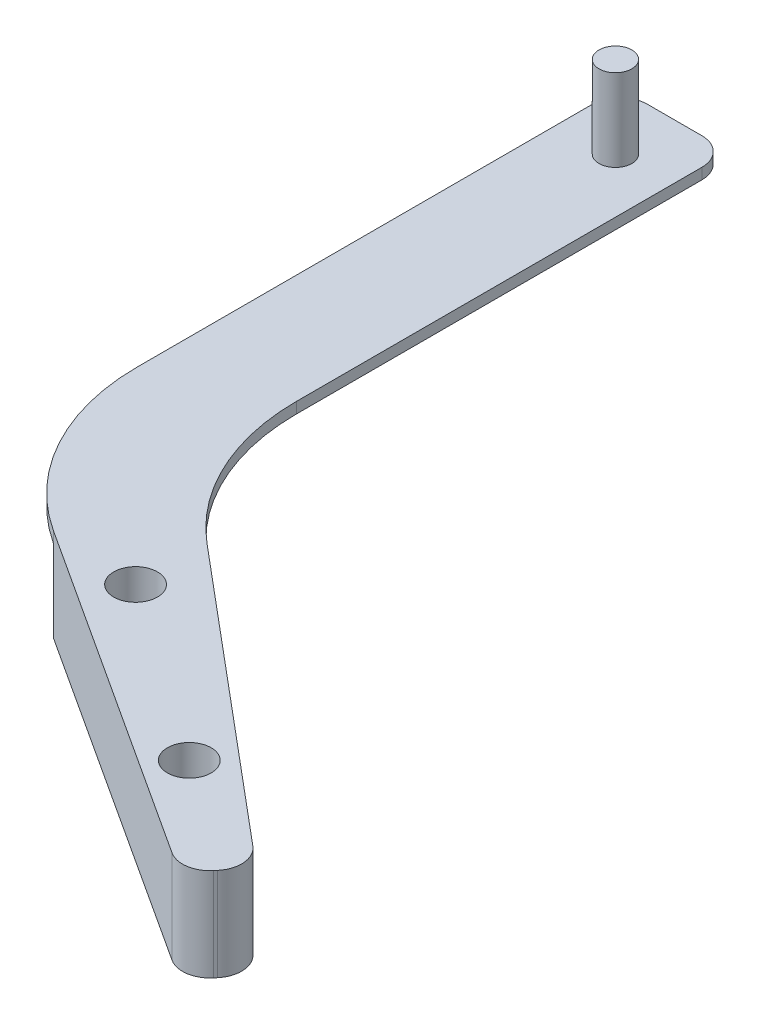
ISO-10303-21;
HEADER;
FILE_DESCRIPTION(('STEP AP214'),'2;1');
FILE_NAME('part.step','',(''),(''),'','','');
FILE_SCHEMA(('AUTOMOTIVE_DESIGN { 1 0 10303 214 1 1 1 1 }'));
ENDSEC;
DATA;
#1=APPLICATION_CONTEXT('core data for automotive mechanical design processes');
#2=APPLICATION_PROTOCOL_DEFINITION('international standard','automotive_design',2000,#1);
#3=PRODUCT_CONTEXT('',#1,'mechanical');
#4=PRODUCT('Part','Part','',(#3));
#5=PRODUCT_RELATED_PRODUCT_CATEGORY('part','',(#4));
#6=PRODUCT_DEFINITION_FORMATION('','',#4);
#7=PRODUCT_DEFINITION_CONTEXT('part definition',#1,'design');
#8=PRODUCT_DEFINITION('design','',#6,#7);
#9=PRODUCT_DEFINITION_SHAPE('','',#8);
#10=(LENGTH_UNIT() NAMED_UNIT(*) SI_UNIT(.MILLI.,.METRE.));
#11=(NAMED_UNIT(*) PLANE_ANGLE_UNIT() SI_UNIT($,.RADIAN.));
#12=(NAMED_UNIT(*) SI_UNIT($,.STERADIAN.) SOLID_ANGLE_UNIT());
#13=UNCERTAINTY_MEASURE_WITH_UNIT(LENGTH_MEASURE(1.E-05),#10,'distance_accuracy_value','');
#14=(GEOMETRIC_REPRESENTATION_CONTEXT(3) GLOBAL_UNCERTAINTY_ASSIGNED_CONTEXT((#13)) GLOBAL_UNIT_ASSIGNED_CONTEXT((#10,
#11,#12)) REPRESENTATION_CONTEXT('',''));
#15=CARTESIAN_POINT('',(0.,0.,0.));
#16=DIRECTION('',(0.,0.,1.));
#17=DIRECTION('',(1.,0.,0.));
#18=AXIS2_PLACEMENT_3D('',#15,#16,#17);
#19=CARTESIAN_POINT('',(73.8670567945439,-2.,66.6448966940016));
#20=DIRECTION('',(0.766044443118979,0.,0.642787609686538));
#21=DIRECTION('',(0.642787609686538,0.,-0.766044443118979));
#22=AXIS2_PLACEMENT_3D('',#19,#20,#21);
#23=PLANE('',#22);
#24=DIRECTION('',(0.642787609686538,0.,-0.766044443118979));
#25=VECTOR('',#24,1.);
#26=CARTESIAN_POINT('',(73.8670567945439,0.,66.6448966940016));
#27=LINE('',#26,#25);
#28=CARTESIAN_POINT('',(76.7105089847099,0.,63.2562023310013));
#29=VERTEX_POINT('',#28);
#30=CARTESIAN_POINT('',(77.0809948429766,0.,62.8146744784067));
#31=VERTEX_POINT('',#30);
#32=EDGE_CURVE('E197',#29,#31,#27,.T.);
#33=ORIENTED_EDGE('',*,*,#32,.F.);
#34=DIRECTION('',(0.,1.,0.));
#35=VECTOR('',#34,1.);
#36=CARTESIAN_POINT('',(76.7105089847099,-2.,63.2562023310013));
#37=LINE('',#36,#35);
#38=CARTESIAN_POINT('',(76.7105089847099,-17.,63.2562023310013));
#39=VERTEX_POINT('',#38);
#40=EDGE_CURVE('E282',#29,#39,#37,.F.);
#41=ORIENTED_EDGE('',*,*,#40,.T.);
#42=DIRECTION('',(-0.642787609686538,0.,0.766044443118979));
#43=VECTOR('',#42,1.);
#44=CARTESIAN_POINT('',(73.8670567945439,-17.,66.6448966940016));
#45=LINE('',#44,#43);
#46=CARTESIAN_POINT('',(77.0809948429766,-17.,62.8146744784067));
#47=VERTEX_POINT('',#46);
#48=EDGE_CURVE('E166',#47,#39,#45,.T.);
#49=ORIENTED_EDGE('',*,*,#48,.F.);
#50=DIRECTION('',(0.,1.,0.));
#51=VECTOR('',#50,1.);
#52=CARTESIAN_POINT('',(77.0809948429766,-2.,62.8146744784067));
#53=LINE('',#52,#51);
#54=EDGE_CURVE('E278',#47,#31,#53,.T.);
#55=ORIENTED_EDGE('',*,*,#54,.T.);
#56=EDGE_LOOP('',(#33,#41,#49,#55));
#57=FACE_BOUND('',#56,.T.);
#58=ADVANCED_FACE('F54',(#57),#23,.T.);
#59=CARTESIAN_POINT('',(8.21443859940037,-2.,24.0095879247784));
#60=DIRECTION('',(-0.544639035015027,0.,0.838670567945424));
#61=DIRECTION('',(0.838670567945424,0.,0.544639035015027));
#62=AXIS2_PLACEMENT_3D('',#59,#60,#61);
#63=PLANE('',#62);
#64=DIRECTION('',(-0.838670567945424,0.,-0.544639035015027));
#65=VECTOR('',#64,1.);
#66=CARTESIAN_POINT('',(8.21443859940037,-17.,24.0095879247784));
#67=LINE('',#66,#65);
#68=CARTESIAN_POINT('',(70.1570915940399,-17.,64.2356171222957));
#69=VERTEX_POINT('',#68);
#70=CARTESIAN_POINT('',(8.21443859940037,-17.,24.0095879247784));
#71=VERTEX_POINT('',#70);
#72=EDGE_CURVE('E174',#69,#71,#67,.T.);
#73=ORIENTED_EDGE('',*,*,#72,.F.);
#74=DIRECTION('',(0.,1.,0.));
#75=VECTOR('',#74,1.);
#76=CARTESIAN_POINT('',(70.1570915940399,-2.,64.2356171222957));
#77=LINE('',#76,#75);
#78=CARTESIAN_POINT('',(70.1570915940399,0.,64.2356171222957));
#79=VERTEX_POINT('',#78);
#80=EDGE_CURVE('E262',#69,#79,#77,.T.);
#81=ORIENTED_EDGE('',*,*,#80,.T.);
#82=DIRECTION('',(0.838670567945424,0.,0.544639035015027));
#83=VECTOR('',#82,1.);
#84=CARTESIAN_POINT('',(8.21443859940037,0.,24.0095879247784));
#85=LINE('',#84,#83);
#86=CARTESIAN_POINT('',(8.21443859940037,0.,24.0095879247784));
#87=VERTEX_POINT('',#86);
#88=EDGE_CURVE('E203',#87,#79,#85,.T.);
#89=ORIENTED_EDGE('',*,*,#88,.F.);
#90=DIRECTION('',(0.,1.,0.));
#91=VECTOR('',#90,1.);
#92=CARTESIAN_POINT('',(8.21443859940037,-2.,24.0095879247784));
#93=LINE('',#92,#91);
#94=CARTESIAN_POINT('',(8.21443859940037,-2.,24.0095879247784));
#95=VERTEX_POINT('',#94);
#96=EDGE_CURVE('E246',#95,#87,#93,.T.);
#97=ORIENTED_EDGE('',*,*,#96,.F.);
#98=DIRECTION('',(0.,1.,0.));
#99=VECTOR('',#98,1.);
#100=CARTESIAN_POINT('',(8.21443859940037,-17.,24.0095879247784));
#101=LINE('',#100,#99);
#102=EDGE_CURVE('E184',#71,#95,#101,.T.);
#103=ORIENTED_EDGE('',*,*,#102,.F.);
#104=EDGE_LOOP('',(#73,#81,#89,#97,#103));
#105=FACE_BOUND('',#104,.T.);
#106=ADVANCED_FACE('F324',(#105),#63,.T.);
#107=CARTESIAN_POINT('',(30.0000000000011,-2.,-9.53723479304036));
#108=DIRECTION('',(0.,1.,0.));
#109=DIRECTION('',(0.,0.,1.));
#110=AXIS2_PLACEMENT_3D('',#107,#108,#109);
#111=CYLINDRICAL_SURFACE('',#110,40.0000000000005);
#112=CARTESIAN_POINT('',(30.0000000000011,0.,-9.53723479304036));
#113=DIRECTION('',(0.,1.,0.));
#114=DIRECTION('',(0.,0.,-1.));
#115=AXIS2_PLACEMENT_3D('',#112,#113,#114);
#116=CIRCLE('',#115,40.0000000000005);
#117=CARTESIAN_POINT('',(-9.99999999999939,0.,-9.53723479303865));
#118=VERTEX_POINT('',#117);
#119=EDGE_CURVE('E239',#118,#87,#116,.T.);
#120=ORIENTED_EDGE('',*,*,#119,.F.);
#121=DIRECTION('',(0.,1.,0.));
#122=VECTOR('',#121,1.);
#123=CARTESIAN_POINT('',(-9.99999999999939,-2.,-9.53723479303865));
#124=LINE('',#123,#122);
#125=CARTESIAN_POINT('',(-9.99999999999939,-2.,-9.53723479303865));
#126=VERTEX_POINT('',#125);
#127=EDGE_CURVE('E250',#126,#118,#124,.T.);
#128=ORIENTED_EDGE('',*,*,#127,.F.);
#129=CARTESIAN_POINT('',(30.0000000000011,-2.,-9.53723479304036));
#130=DIRECTION('',(0.,1.,0.));
#131=DIRECTION('',(0.,0.,-1.));
#132=AXIS2_PLACEMENT_3D('',#129,#130,#131);
#133=CIRCLE('',#132,40.0000000000005);
#134=EDGE_CURVE('E213',#126,#95,#133,.T.);
#135=ORIENTED_EDGE('',*,*,#134,.T.);
#136=ORIENTED_EDGE('',*,*,#96,.T.);
#137=EDGE_LOOP('',(#120,#128,#135,#136));
#138=FACE_BOUND('',#137,.T.);
#139=ADVANCED_FACE('F320',(#138),#111,.T.);
#140=CARTESIAN_POINT('',(-9.99999999999864,-2.,-97.8190068075028));
#141=DIRECTION('',(-1.,0.,0.));
#142=DIRECTION('',(0.,0.,1.));
#143=AXIS2_PLACEMENT_3D('',#140,#141,#142);
#144=PLANE('',#143);
#145=DIRECTION('',(0.,0.,1.));
#146=VECTOR('',#145,1.);
#147=CARTESIAN_POINT('',(-9.99999999999864,0.,-97.8190068075028));
#148=LINE('',#147,#146);
#149=CARTESIAN_POINT('',(-9.99999999999864,0.,-92.8190068075028));
#150=VERTEX_POINT('',#149);
#151=EDGE_CURVE('E236',#150,#118,#148,.T.);
#152=ORIENTED_EDGE('',*,*,#151,.F.);
#153=DIRECTION('',(0.,1.,0.));
#154=VECTOR('',#153,1.);
#155=CARTESIAN_POINT('',(-9.99999999999864,-2.,-92.8190068075028));
#156=LINE('',#155,#154);
#157=CARTESIAN_POINT('',(-9.99999999999864,-2.,-92.8190068075028));
#158=VERTEX_POINT('',#157);
#159=EDGE_CURVE('E78',#150,#158,#156,.F.);
#160=ORIENTED_EDGE('',*,*,#159,.T.);
#161=DIRECTION('',(0.,0.,1.));
#162=VECTOR('',#161,1.);
#163=CARTESIAN_POINT('',(-9.99999999999864,-2.,-97.8190068075028));
#164=LINE('',#163,#162);
#165=EDGE_CURVE('E210',#158,#126,#164,.T.);
#166=ORIENTED_EDGE('',*,*,#165,.T.);
#167=ORIENTED_EDGE('',*,*,#127,.T.);
#168=EDGE_LOOP('',(#152,#160,#166,#167));
#169=FACE_BOUND('',#168,.T.);
#170=ADVANCED_FACE('F316',(#169),#144,.T.);
#171=CARTESIAN_POINT('',(10.0000000000014,-2.,-97.8190068075028));
#172=DIRECTION('',(0.,0.,-1.));
#173=DIRECTION('',(-1.,0.,0.));
#174=AXIS2_PLACEMENT_3D('',#171,#172,#173);
#175=PLANE('',#174);
#176=DIRECTION('',(-1.,0.,0.));
#177=VECTOR('',#176,1.);
#178=CARTESIAN_POINT('',(10.0000000000014,-2.,-97.8190068075028));
#179=LINE('',#178,#177);
#180=CARTESIAN_POINT('',(5.00000000000136,-2.,-97.8190068075028));
#181=VERTEX_POINT('',#180);
#182=CARTESIAN_POINT('',(-4.99999999999864,-2.,-97.8190068075028));
#183=VERTEX_POINT('',#182);
#184=EDGE_CURVE('E206',#181,#183,#179,.T.);
#185=ORIENTED_EDGE('',*,*,#184,.T.);
#186=DIRECTION('',(0.,1.,0.));
#187=VECTOR('',#186,1.);
#188=CARTESIAN_POINT('',(-4.99999999999864,-2.,-97.8190068075028));
#189=LINE('',#188,#187);
#190=CARTESIAN_POINT('',(-4.99999999999864,0.,-97.8190068075028));
#191=VERTEX_POINT('',#190);
#192=EDGE_CURVE('E296',#183,#191,#189,.T.);
#193=ORIENTED_EDGE('',*,*,#192,.T.);
#194=DIRECTION('',(-1.,0.,0.));
#195=VECTOR('',#194,1.);
#196=CARTESIAN_POINT('',(10.0000000000014,0.,-97.8190068075028));
#197=LINE('',#196,#195);
#198=CARTESIAN_POINT('',(5.00000000000136,0.,-97.8190068075028));
#199=VERTEX_POINT('',#198);
#200=EDGE_CURVE('E232',#199,#191,#197,.T.);
#201=ORIENTED_EDGE('',*,*,#200,.F.);
#202=DIRECTION('',(0.,1.,0.));
#203=VECTOR('',#202,1.);
#204=CARTESIAN_POINT('',(5.00000000000136,-2.,-97.8190068075028));
#205=LINE('',#204,#203);
#206=EDGE_CURVE('E293',#199,#181,#205,.F.);
#207=ORIENTED_EDGE('',*,*,#206,.T.);
#208=EDGE_LOOP('',(#185,#193,#201,#207));
#209=FACE_BOUND('',#208,.T.);
#210=ADVANCED_FACE('F310',(#209),#175,.T.);
#211=CARTESIAN_POINT('',(10.0000000000014,-2.,-18.6523063262));
#212=DIRECTION('',(1.,0.,0.));
#213=DIRECTION('',(0.,0.,-1.));
#214=AXIS2_PLACEMENT_3D('',#211,#212,#213);
#215=PLANE('',#214);
#216=DIRECTION('',(0.,0.,-1.));
#217=VECTOR('',#216,1.);
#218=CARTESIAN_POINT('',(10.0000000000014,-2.,-18.6523063262));
#219=LINE('',#218,#217);
#220=CARTESIAN_POINT('',(10.0000000000014,-2.,-18.6523063262));
#221=VERTEX_POINT('',#220);
#222=CARTESIAN_POINT('',(10.0000000000014,-2.,-92.8190068075028));
#223=VERTEX_POINT('',#222);
#224=EDGE_CURVE('E202',#221,#223,#219,.T.);
#225=ORIENTED_EDGE('',*,*,#224,.T.);
#226=DIRECTION('',(0.,1.,0.));
#227=VECTOR('',#226,1.);
#228=CARTESIAN_POINT('',(10.0000000000014,-2.,-92.8190068075028));
#229=LINE('',#228,#227);
#230=CARTESIAN_POINT('',(10.0000000000014,0.,-92.8190068075028));
#231=VERTEX_POINT('',#230);
#232=EDGE_CURVE('E13',#223,#231,#229,.T.);
#233=ORIENTED_EDGE('',*,*,#232,.T.);
#234=DIRECTION('',(0.,0.,-1.));
#235=VECTOR('',#234,1.);
#236=CARTESIAN_POINT('',(10.0000000000014,0.,-18.6523063262));
#237=LINE('',#236,#235);
#238=CARTESIAN_POINT('',(10.0000000000014,0.,-18.6523063262));
#239=VERTEX_POINT('',#238);
#240=EDGE_CURVE('E228',#239,#231,#237,.T.);
#241=ORIENTED_EDGE('',*,*,#240,.F.);
#242=DIRECTION('',(0.,1.,0.));
#243=VECTOR('',#242,1.);
#244=CARTESIAN_POINT('',(10.0000000000014,-2.,-18.6523063262));
#245=LINE('',#244,#243);
#246=EDGE_CURVE('E254',#221,#239,#245,.T.);
#247=ORIENTED_EDGE('',*,*,#246,.F.);
#248=EDGE_LOOP('',(#225,#233,#241,#247));
#249=FACE_BOUND('',#248,.T.);
#250=ADVANCED_FACE('F342',(#249),#215,.T.);
#251=CARTESIAN_POINT('',(50.,-2.,-18.6523063262));
#252=DIRECTION('',(0.,1.,0.));
#253=DIRECTION('',(0.,0.,1.));
#254=AXIS2_PLACEMENT_3D('',#251,#252,#253);
#255=CYLINDRICAL_SURFACE('',#254,39.9999999999989);
#256=CARTESIAN_POINT('',(50.,0.,-18.6523063262));
#257=DIRECTION('',(0.,-1.,0.));
#258=DIRECTION('',(0.,0.,-1.));
#259=AXIS2_PLACEMENT_3D('',#256,#257,#258);
#260=CIRCLE('',#259,39.9999999999989);
#261=CARTESIAN_POINT('',(24.28849561254,0.,11.989471398559));
#262=VERTEX_POINT('',#261);
#263=EDGE_CURVE('E224',#262,#239,#260,.T.);
#264=ORIENTED_EDGE('',*,*,#263,.F.);
#265=DIRECTION('',(0.,1.,0.));
#266=VECTOR('',#265,1.);
#267=CARTESIAN_POINT('',(24.28849561254,-2.,11.989471398559));
#268=LINE('',#267,#266);
#269=CARTESIAN_POINT('',(24.28849561254,-2.,11.989471398559));
#270=VERTEX_POINT('',#269);
#271=EDGE_CURVE('E217',#270,#262,#268,.T.);
#272=ORIENTED_EDGE('',*,*,#271,.F.);
#273=CARTESIAN_POINT('',(50.,-2.,-18.6523063262));
#274=DIRECTION('',(0.,-1.,0.));
#275=DIRECTION('',(0.,0.,-1.));
#276=AXIS2_PLACEMENT_3D('',#273,#274,#275);
#277=CIRCLE('',#276,39.9999999999989);
#278=EDGE_CURVE('E198',#270,#221,#277,.T.);
#279=ORIENTED_EDGE('',*,*,#278,.T.);
#280=ORIENTED_EDGE('',*,*,#246,.T.);
#281=EDGE_LOOP('',(#264,#272,#279,#280));
#282=FACE_BOUND('',#281,.T.);
#283=ADVANCED_FACE('F339',(#282),#255,.F.);
#284=CARTESIAN_POINT('',(80.2949328914093,-2.,58.9844522628118));
#285=DIRECTION('',(0.642787609686538,0.,-0.76604444311898));
#286=DIRECTION('',(-0.76604444311898,0.,-0.642787609686538));
#287=AXIS2_PLACEMENT_3D('',#284,#285,#286);
#288=PLANE('',#287);
#289=DIRECTION('',(-0.766044443118979,0.,-0.642787609686537));
#290=VECTOR('',#289,1.);
#291=CARTESIAN_POINT('',(80.2949328914093,0.,58.9844522628118));
#292=LINE('',#291,#290);
#293=CARTESIAN_POINT('',(76.4647106758144,0.,55.7705142143791));
#294=VERTEX_POINT('',#293);
#295=EDGE_CURVE('E221',#294,#262,#292,.T.);
#296=ORIENTED_EDGE('',*,*,#295,.F.);
#297=DIRECTION('',(0.,1.,0.));
#298=VECTOR('',#297,1.);
#299=CARTESIAN_POINT('',(76.4647106758144,-2.,55.7705142143791));
#300=LINE('',#299,#298);
#301=CARTESIAN_POINT('',(76.4647106758144,-17.,55.7705142143791));
#302=VERTEX_POINT('',#301);
#303=EDGE_CURVE('E162',#294,#302,#300,.F.);
#304=ORIENTED_EDGE('',*,*,#303,.T.);
#305=DIRECTION('',(0.766044443118977,0.,0.64278760968654));
#306=VECTOR('',#305,1.);
#307=CARTESIAN_POINT('',(80.2949328914093,-17.,58.9844522628118));
#308=LINE('',#307,#306);
#309=CARTESIAN_POINT('',(24.28849561254,-17.,11.989471398559));
#310=VERTEX_POINT('',#309);
#311=EDGE_CURVE('E153',#310,#302,#308,.T.);
#312=ORIENTED_EDGE('',*,*,#311,.F.);
#313=DIRECTION('',(0.,1.,0.));
#314=VECTOR('',#313,1.);
#315=CARTESIAN_POINT('',(24.28849561254,-17.,11.989471398559));
#316=LINE('',#315,#314);
#317=EDGE_CURVE('E159',#310,#270,#316,.T.);
#318=ORIENTED_EDGE('',*,*,#317,.T.);
#319=ORIENTED_EDGE('',*,*,#271,.T.);
#320=EDGE_LOOP('',(#296,#304,#312,#318,#319));
#321=FACE_BOUND('',#320,.T.);
#322=ADVANCED_FACE('F156',(#321),#288,.T.);
#323=CARTESIAN_POINT('',(50.,-2.,-18.6523063262));
#324=DIRECTION('',(0.,-1.,0.));
#325=DIRECTION('',(0.,0.,-1.));
#326=AXIS2_PLACEMENT_3D('',#323,#324,#325);
#327=PLANE('',#326);
#328=ORIENTED_EDGE('',*,*,#165,.F.);
#329=CARTESIAN_POINT('',(-4.99999999999864,-2.,-92.8190068075028));
#330=DIRECTION('',(0.,-1.,0.));
#331=DIRECTION('',(0.,0.,-1.));
#332=AXIS2_PLACEMENT_3D('',#329,#330,#331);
#333=CIRCLE('',#332,5.);
#334=EDGE_CURVE('E63',#158,#183,#333,.T.);
#335=ORIENTED_EDGE('',*,*,#334,.T.);
#336=ORIENTED_EDGE('',*,*,#184,.F.);
#337=CARTESIAN_POINT('',(5.00000000000136,-2.,-92.8190068075028));
#338=DIRECTION('',(0.,-1.,0.));
#339=DIRECTION('',(0.,0.,-1.));
#340=AXIS2_PLACEMENT_3D('',#337,#338,#339);
#341=CIRCLE('',#340,5.);
#342=EDGE_CURVE('E70',#181,#223,#341,.T.);
#343=ORIENTED_EDGE('',*,*,#342,.T.);
#344=ORIENTED_EDGE('',*,*,#224,.F.);
#345=ORIENTED_EDGE('',*,*,#278,.F.);
#346=DIRECTION('',(0.800846410293443,0.,-0.598869791457297));
#347=VECTOR('',#346,1.);
#348=CARTESIAN_POINT('',(24.28849561254,-2.,11.989471398559));
#349=LINE('',#348,#347);
#350=EDGE_CURVE('E179',#95,#270,#349,.T.);
#351=ORIENTED_EDGE('',*,*,#350,.F.);
#352=ORIENTED_EDGE('',*,*,#134,.F.);
#353=EDGE_LOOP('',(#328,#335,#336,#343,#344,#345,#351,#352));
#354=FACE_BOUND('',#353,.T.);
#355=ADVANCED_FACE('F305',(#354),#327,.T.);
#356=CARTESIAN_POINT('',(50.,0.,-18.6523063262));
#357=DIRECTION('',(0.,-1.,0.));
#358=DIRECTION('',(0.,0.,-1.));
#359=AXIS2_PLACEMENT_3D('',#356,#357,#358);
#360=PLANE('',#359);
#361=CARTESIAN_POINT('',(1.36349265211777E-12,0.,-87.));
#362=DIRECTION('',(0.,-1.,0.));
#363=DIRECTION('',(0.,0.,-1.));
#364=AXIS2_PLACEMENT_3D('',#361,#362,#363);
#365=CIRCLE('',#364,3.);
#366=CARTESIAN_POINT('',(1.36349265211777E-12,0.,-90.));
#367=VERTEX_POINT('',#366);
#368=EDGE_CURVE('E249',#367,#367,#365,.F.);
#369=ORIENTED_EDGE('',*,*,#368,.F.);
#370=EDGE_LOOP('',(#369));
#371=FACE_BOUND('',#370,.T.);
#372=CARTESIAN_POINT('',(24.2884956125399,0.,25.043544291882));
#373=DIRECTION('',(0.,1.,0.));
#374=DIRECTION('',(0.,0.,1.));
#375=AXIS2_PLACEMENT_3D('',#372,#373,#374);
#376=CIRCLE('',#375,4.);
#377=CARTESIAN_POINT('',(24.2884956125399,0.,29.043544291882));
#378=VERTEX_POINT('',#377);
#379=EDGE_CURVE('E183',#378,#378,#376,.T.);
#380=ORIENTED_EDGE('',*,*,#379,.F.);
#381=EDGE_LOOP('',(#380));
#382=FACE_BOUND('',#381,.T.);
#383=CARTESIAN_POINT('',(57.0545773840996,0.,47.9866017459238));
#384=DIRECTION('',(0.,1.,0.));
#385=DIRECTION('',(0.,0.,1.));
#386=AXIS2_PLACEMENT_3D('',#383,#384,#385);
#387=CIRCLE('',#386,4.00000000000001);
#388=CARTESIAN_POINT('',(57.0545773840996,0.,51.9866017459238));
#389=VERTEX_POINT('',#388);
#390=EDGE_CURVE('E189',#389,#389,#387,.T.);
#391=ORIENTED_EDGE('',*,*,#390,.F.);
#392=EDGE_LOOP('',(#391));
#393=FACE_BOUND('',#392,.T.);
#394=ORIENTED_EDGE('',*,*,#88,.T.);
#395=CARTESIAN_POINT('',(72.880286769115,0.,60.0422642825686));
#396=DIRECTION('',(0.,-1.,0.));
#397=DIRECTION('',(0.,0.,-1.));
#398=AXIS2_PLACEMENT_3D('',#395,#396,#397);
#399=CIRCLE('',#398,5.);
#400=EDGE_CURVE('E275',#79,#29,#399,.F.);
#401=ORIENTED_EDGE('',*,*,#400,.T.);
#402=ORIENTED_EDGE('',*,*,#32,.T.);
#403=CARTESIAN_POINT('',(73.2507726273817,0.,59.600736429974));
#404=DIRECTION('',(0.,-1.,0.));
#405=DIRECTION('',(0.,0.,-1.));
#406=AXIS2_PLACEMENT_3D('',#403,#404,#405);
#407=CIRCLE('',#406,5.);
#408=EDGE_CURVE('E272',#31,#294,#407,.F.);
#409=ORIENTED_EDGE('',*,*,#408,.T.);
#410=ORIENTED_EDGE('',*,*,#295,.T.);
#411=ORIENTED_EDGE('',*,*,#263,.T.);
#412=ORIENTED_EDGE('',*,*,#240,.T.);
#413=CARTESIAN_POINT('',(5.00000000000136,0.,-92.8190068075028));
#414=DIRECTION('',(0.,-1.,0.));
#415=DIRECTION('',(0.,0.,-1.));
#416=AXIS2_PLACEMENT_3D('',#413,#414,#415);
#417=CIRCLE('',#416,5.);
#418=EDGE_CURVE('E266',#231,#199,#417,.F.);
#419=ORIENTED_EDGE('',*,*,#418,.T.);
#420=ORIENTED_EDGE('',*,*,#200,.T.);
#421=CARTESIAN_POINT('',(-4.99999999999864,0.,-92.8190068075028));
#422=DIRECTION('',(0.,-1.,0.));
#423=DIRECTION('',(0.,0.,-1.));
#424=AXIS2_PLACEMENT_3D('',#421,#422,#423);
#425=CIRCLE('',#424,5.);
#426=EDGE_CURVE('E269',#191,#150,#425,.F.);
#427=ORIENTED_EDGE('',*,*,#426,.T.);
#428=ORIENTED_EDGE('',*,*,#151,.T.);
#429=ORIENTED_EDGE('',*,*,#119,.T.);
#430=EDGE_LOOP('',(#394,#401,#402,#409,#410,#411,#412,#419,#420,#427,#428,#429));
#431=FACE_BOUND('',#430,.T.);
#432=ADVANCED_FACE('F315',(#371,#382,#393,#431),#360,.F.);
#433=CARTESIAN_POINT('',(57.0545773840996,-2.,47.9866017459238));
#434=DIRECTION('',(0.,1.,0.));
#435=DIRECTION('',(0.,0.,1.));
#436=AXIS2_PLACEMENT_3D('',#433,#434,#435);
#437=CYLINDRICAL_SURFACE('',#436,4.00000000000001);
#438=ORIENTED_EDGE('',*,*,#390,.T.);
#439=EDGE_LOOP('',(#438));
#440=FACE_BOUND('',#439,.T.);
#441=CARTESIAN_POINT('',(57.0545773840996,-17.,47.9866017459238));
#442=DIRECTION('',(0.,-1.,0.));
#443=DIRECTION('',(0.,0.,-1.));
#444=AXIS2_PLACEMENT_3D('',#441,#442,#443);
#445=CIRCLE('',#444,4.00000000000001);
#446=CARTESIAN_POINT('',(57.0545773840996,-17.,43.9866017459238));
#447=VERTEX_POINT('',#446);
#448=EDGE_CURVE('E560',#447,#447,#445,.T.);
#449=ORIENTED_EDGE('',*,*,#448,.T.);
#450=EDGE_LOOP('',(#449));
#451=FACE_BOUND('',#450,.T.);
#452=ADVANCED_FACE('F425',(#440,#451),#437,.F.);
#453=CARTESIAN_POINT('',(24.2884956125399,-2.,25.043544291882));
#454=DIRECTION('',(0.,1.,0.));
#455=DIRECTION('',(0.,0.,1.));
#456=AXIS2_PLACEMENT_3D('',#453,#454,#455);
#457=CYLINDRICAL_SURFACE('',#456,4.);
#458=ORIENTED_EDGE('',*,*,#379,.T.);
#459=EDGE_LOOP('',(#458));
#460=FACE_BOUND('',#459,.T.);
#461=CARTESIAN_POINT('',(24.2884956125399,-17.,25.043544291882));
#462=DIRECTION('',(0.,-1.,0.));
#463=DIRECTION('',(0.,0.,-1.));
#464=AXIS2_PLACEMENT_3D('',#461,#462,#463);
#465=CIRCLE('',#464,4.);
#466=CARTESIAN_POINT('',(24.2884956125399,-17.,21.043544291882));
#467=VERTEX_POINT('',#466);
#468=EDGE_CURVE('E562',#467,#467,#465,.T.);
#469=ORIENTED_EDGE('',*,*,#468,.T.);
#470=EDGE_LOOP('',(#469));
#471=FACE_BOUND('',#470,.T.);
#472=ADVANCED_FACE('F415',(#460,#471),#457,.F.);
#473=CARTESIAN_POINT('',(0.,-17.,0.));
#474=DIRECTION('',(0.,-1.,0.));
#475=DIRECTION('',(0.,0.,-1.));
#476=AXIS2_PLACEMENT_3D('',#473,#474,#475);
#477=PLANE('',#476);
#478=ORIENTED_EDGE('',*,*,#468,.F.);
#479=EDGE_LOOP('',(#478));
#480=FACE_BOUND('',#479,.T.);
#481=ORIENTED_EDGE('',*,*,#48,.T.);
#482=CARTESIAN_POINT('',(72.880286769115,-17.,60.0422642825686));
#483=DIRECTION('',(0.,-1.,0.));
#484=DIRECTION('',(0.,0.,-1.));
#485=AXIS2_PLACEMENT_3D('',#482,#483,#484);
#486=CIRCLE('',#485,5.);
#487=EDGE_CURVE('E288',#39,#69,#486,.T.);
#488=ORIENTED_EDGE('',*,*,#487,.T.);
#489=ORIENTED_EDGE('',*,*,#72,.T.);
#490=DIRECTION('',(0.800846410293443,0.,-0.598869791457297));
#491=VECTOR('',#490,1.);
#492=CARTESIAN_POINT('',(24.28849561254,-17.,11.989471398559));
#493=LINE('',#492,#491);
#494=EDGE_CURVE('E167',#71,#310,#493,.T.);
#495=ORIENTED_EDGE('',*,*,#494,.T.);
#496=ORIENTED_EDGE('',*,*,#311,.T.);
#497=CARTESIAN_POINT('',(73.2507726273817,-17.,59.600736429974));
#498=DIRECTION('',(0.,-1.,0.));
#499=DIRECTION('',(0.,0.,-1.));
#500=AXIS2_PLACEMENT_3D('',#497,#498,#499);
#501=CIRCLE('',#500,5.);
#502=EDGE_CURVE('E285',#302,#47,#501,.T.);
#503=ORIENTED_EDGE('',*,*,#502,.T.);
#504=EDGE_LOOP('',(#481,#488,#489,#495,#496,#503));
#505=FACE_BOUND('',#504,.T.);
#506=ORIENTED_EDGE('',*,*,#448,.F.);
#507=EDGE_LOOP('',(#506));
#508=FACE_BOUND('',#507,.T.);
#509=ADVANCED_FACE('F171',(#480,#505,#508),#477,.T.);
#510=CARTESIAN_POINT('',(24.28849561254,-17.,11.989471398559));
#511=DIRECTION('',(0.598869791457297,0.,0.800846410293443));
#512=DIRECTION('',(0.800846410293443,0.,-0.598869791457297));
#513=AXIS2_PLACEMENT_3D('',#510,#511,#512);
#514=PLANE('',#513);
#515=ORIENTED_EDGE('',*,*,#350,.T.);
#516=ORIENTED_EDGE('',*,*,#317,.F.);
#517=ORIENTED_EDGE('',*,*,#494,.F.);
#518=ORIENTED_EDGE('',*,*,#102,.T.);
#519=EDGE_LOOP('',(#515,#516,#517,#518));
#520=FACE_BOUND('',#519,.T.);
#521=ADVANCED_FACE('F181',(#520),#514,.F.);
#522=CARTESIAN_POINT('',(1.36349265211777E-12,15.,-87.));
#523=DIRECTION('',(0.,-1.,0.));
#524=DIRECTION('',(0.,0.,-1.));
#525=AXIS2_PLACEMENT_3D('',#522,#523,#524);
#526=CYLINDRICAL_SURFACE('',#525,3.);
#527=CARTESIAN_POINT('',(1.36349265211777E-12,15.,-87.));
#528=DIRECTION('',(0.,1.,0.));
#529=DIRECTION('',(0.,0.,1.));
#530=AXIS2_PLACEMENT_3D('',#527,#528,#529);
#531=CIRCLE('',#530,3.);
#532=CARTESIAN_POINT('',(1.36349265211777E-12,15.,-84.));
#533=VERTEX_POINT('',#532);
#534=EDGE_CURVE('E563',#533,#533,#531,.T.);
#535=ORIENTED_EDGE('',*,*,#534,.F.);
#536=EDGE_LOOP('',(#535));
#537=FACE_BOUND('',#536,.T.);
#538=ORIENTED_EDGE('',*,*,#368,.T.);
#539=EDGE_LOOP('',(#538));
#540=FACE_BOUND('',#539,.T.);
#541=ADVANCED_FACE('F391',(#537,#540),#526,.T.);
#542=CARTESIAN_POINT('',(1.36349265211777E-12,15.,-87.));
#543=DIRECTION('',(0.,1.,0.));
#544=DIRECTION('',(0.,0.,1.));
#545=AXIS2_PLACEMENT_3D('',#542,#543,#544);
#546=PLANE('',#545);
#547=ORIENTED_EDGE('',*,*,#534,.T.);
#548=EDGE_LOOP('',(#547));
#549=FACE_BOUND('',#548,.T.);
#550=ADVANCED_FACE('F360',(#549),#546,.T.);
#551=CARTESIAN_POINT('',(72.880286769115,-2.,60.0422642825686));
#552=DIRECTION('',(0.,1.,0.));
#553=DIRECTION('',(0.,0.,1.));
#554=AXIS2_PLACEMENT_3D('',#551,#552,#553);
#555=CYLINDRICAL_SURFACE('',#554,5.);
#556=ORIENTED_EDGE('',*,*,#487,.F.);
#557=ORIENTED_EDGE('',*,*,#40,.F.);
#558=ORIENTED_EDGE('',*,*,#400,.F.);
#559=ORIENTED_EDGE('',*,*,#80,.F.);
#560=EDGE_LOOP('',(#556,#557,#558,#559));
#561=FACE_BOUND('',#560,.T.);
#562=ADVANCED_FACE('F328',(#561),#555,.T.);
#563=CARTESIAN_POINT('',(73.2507726273817,-2.,59.600736429974));
#564=DIRECTION('',(0.,1.,0.));
#565=DIRECTION('',(0.,0.,1.));
#566=AXIS2_PLACEMENT_3D('',#563,#564,#565);
#567=CYLINDRICAL_SURFACE('',#566,5.);
#568=ORIENTED_EDGE('',*,*,#502,.F.);
#569=ORIENTED_EDGE('',*,*,#303,.F.);
#570=ORIENTED_EDGE('',*,*,#408,.F.);
#571=ORIENTED_EDGE('',*,*,#54,.F.);
#572=EDGE_LOOP('',(#568,#569,#570,#571));
#573=FACE_BOUND('',#572,.T.);
#574=ADVANCED_FACE('F335',(#573),#567,.T.);
#575=CARTESIAN_POINT('',(-4.99999999999864,-2.,-92.8190068075028));
#576=DIRECTION('',(0.,1.,0.));
#577=DIRECTION('',(0.,0.,1.));
#578=AXIS2_PLACEMENT_3D('',#575,#576,#577);
#579=CYLINDRICAL_SURFACE('',#578,5.);
#580=ORIENTED_EDGE('',*,*,#334,.F.);
#581=ORIENTED_EDGE('',*,*,#159,.F.);
#582=ORIENTED_EDGE('',*,*,#426,.F.);
#583=ORIENTED_EDGE('',*,*,#192,.F.);
#584=EDGE_LOOP('',(#580,#581,#582,#583));
#585=FACE_BOUND('',#584,.T.);
#586=ADVANCED_FACE('F313',(#585),#579,.T.);
#587=CARTESIAN_POINT('',(5.00000000000136,-2.,-92.8190068075028));
#588=DIRECTION('',(0.,1.,0.));
#589=DIRECTION('',(0.,0.,1.));
#590=AXIS2_PLACEMENT_3D('',#587,#588,#589);
#591=CYLINDRICAL_SURFACE('',#590,5.);
#592=ORIENTED_EDGE('',*,*,#342,.F.);
#593=ORIENTED_EDGE('',*,*,#206,.F.);
#594=ORIENTED_EDGE('',*,*,#418,.F.);
#595=ORIENTED_EDGE('',*,*,#232,.F.);
#596=EDGE_LOOP('',(#592,#593,#594,#595));
#597=FACE_BOUND('',#596,.T.);
#598=ADVANCED_FACE('F56',(#597),#591,.T.);
#599=CLOSED_SHELL('',(#58,#106,#139,#170,#210,#250,#283,#322,#355,#432,#452,#472,#509,#521,#541,
#550,#562,#574,#586,#598));
#600=MANIFOLD_SOLID_BREP('B2',#599);
#601=ADVANCED_BREP_SHAPE_REPRESENTATION('',(#18,#600),#14);
#602=SHAPE_DEFINITION_REPRESENTATION(#9,#601);
ENDSEC;
END-ISO-10303-21;
